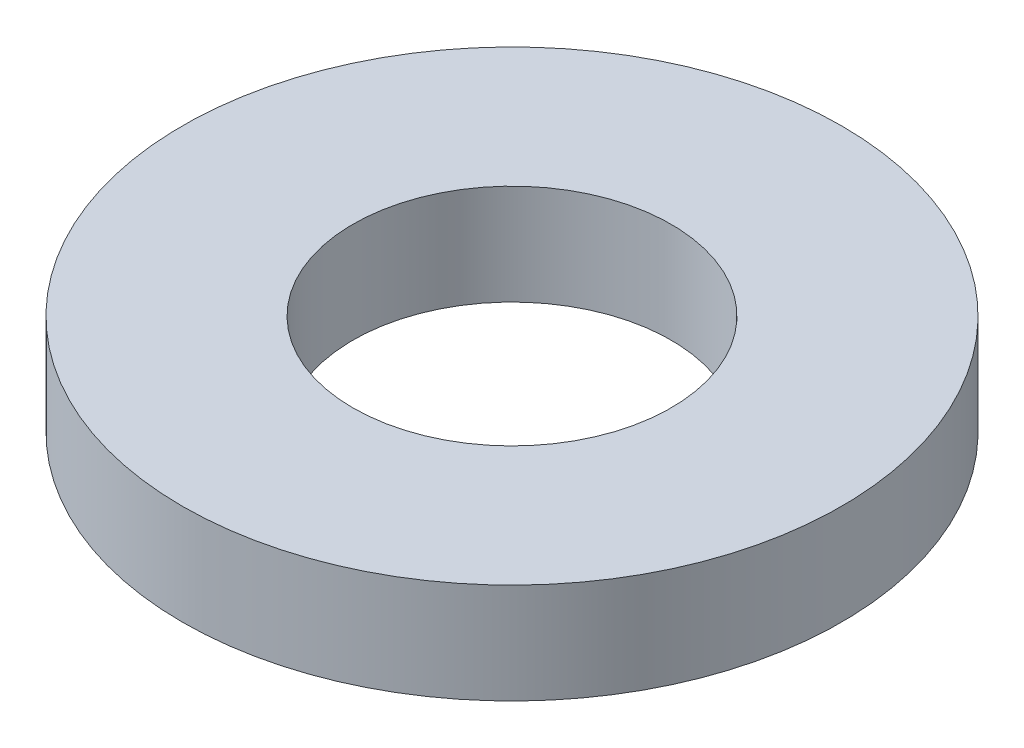
ISO-10303-21;
HEADER;
FILE_DESCRIPTION(('STEP AP214'),'2;1');
FILE_NAME('part.step','',(''),(''),'','','');
FILE_SCHEMA(('AUTOMOTIVE_DESIGN { 1 0 10303 214 1 1 1 1 }'));
ENDSEC;
DATA;
#1=APPLICATION_CONTEXT('core data for automotive mechanical design processes');
#2=APPLICATION_PROTOCOL_DEFINITION('international standard','automotive_design',2000,#1);
#3=PRODUCT_CONTEXT('',#1,'mechanical');
#4=PRODUCT('Part','Part','',(#3));
#5=PRODUCT_RELATED_PRODUCT_CATEGORY('part','',(#4));
#6=PRODUCT_DEFINITION_FORMATION('','',#4);
#7=PRODUCT_DEFINITION_CONTEXT('part definition',#1,'design');
#8=PRODUCT_DEFINITION('design','',#6,#7);
#9=PRODUCT_DEFINITION_SHAPE('','',#8);
#10=(LENGTH_UNIT() NAMED_UNIT(*) SI_UNIT(.MILLI.,.METRE.));
#11=(NAMED_UNIT(*) PLANE_ANGLE_UNIT() SI_UNIT($,.RADIAN.));
#12=(NAMED_UNIT(*) SI_UNIT($,.STERADIAN.) SOLID_ANGLE_UNIT());
#13=UNCERTAINTY_MEASURE_WITH_UNIT(LENGTH_MEASURE(1.E-05),#10,'distance_accuracy_value','');
#14=(GEOMETRIC_REPRESENTATION_CONTEXT(3) GLOBAL_UNCERTAINTY_ASSIGNED_CONTEXT((#13)) GLOBAL_UNIT_ASSIGNED_CONTEXT((#10,
#11,#12)) REPRESENTATION_CONTEXT('',''));
#15=CARTESIAN_POINT('',(0.,0.,0.));
#16=DIRECTION('',(0.,0.,1.));
#17=DIRECTION('',(1.,0.,0.));
#18=AXIS2_PLACEMENT_3D('',#15,#16,#17);
#19=CARTESIAN_POINT('',(41.0577939001171,-18.9871426298124,10.4000283791901));
#20=DIRECTION('',(0.,1.,0.));
#21=DIRECTION('',(0.,0.,1.));
#22=AXIS2_PLACEMENT_3D('',#19,#20,#21);
#23=PLANE('',#22);
#24=CARTESIAN_POINT('',(36.857793900117,-18.9871426298124,10.4000283791901));
#25=DIRECTION('',(0.,1.,0.));
#26=DIRECTION('',(0.,0.,1.));
#27=AXIS2_PLACEMENT_3D('',#24,#25,#26);
#28=CIRCLE('',#27,8.7);
#29=CARTESIAN_POINT('',(36.857793900117,-18.9871426298124,19.1000283791901));
#30=VERTEX_POINT('',#29);
#31=EDGE_CURVE('E10',#30,#30,#28,.T.);
#32=ORIENTED_EDGE('',*,*,#31,.T.);
#33=EDGE_LOOP('',(#32));
#34=FACE_BOUND('',#33,.T.);
#35=CARTESIAN_POINT('',(36.857793900117,-18.9871426298124,10.4000283791901));
#36=DIRECTION('',(0.,1.,0.));
#37=DIRECTION('',(0.,0.,1.));
#38=AXIS2_PLACEMENT_3D('',#35,#36,#37);
#39=CIRCLE('',#38,4.20000000000001);
#40=CARTESIAN_POINT('',(36.857793900117,-18.9871426298124,14.6000283791901));
#41=VERTEX_POINT('',#40);
#42=EDGE_CURVE('E40',#41,#41,#39,.T.);
#43=ORIENTED_EDGE('',*,*,#42,.F.);
#44=EDGE_LOOP('',(#43));
#45=FACE_BOUND('',#44,.T.);
#46=ADVANCED_FACE('F26',(#34,#45),#23,.T.);
#47=CARTESIAN_POINT('',(36.857793900117,-21.6371426298124,10.4000283791901));
#48=DIRECTION('',(0.,1.,0.));
#49=DIRECTION('',(0.,0.,1.));
#50=AXIS2_PLACEMENT_3D('',#47,#48,#49);
#51=CYLINDRICAL_SURFACE('',#50,8.7);
#52=CARTESIAN_POINT('',(36.857793900117,-21.6371426298124,10.4000283791901));
#53=DIRECTION('',(0.,1.,0.));
#54=DIRECTION('',(0.,0.,1.));
#55=AXIS2_PLACEMENT_3D('',#52,#53,#54);
#56=CIRCLE('',#55,8.7);
#57=CARTESIAN_POINT('',(36.857793900117,-21.6371426298124,19.1000283791901));
#58=VERTEX_POINT('',#57);
#59=EDGE_CURVE('E32',#58,#58,#56,.T.);
#60=ORIENTED_EDGE('',*,*,#59,.T.);
#61=EDGE_LOOP('',(#60));
#62=FACE_BOUND('',#61,.T.);
#63=ORIENTED_EDGE('',*,*,#31,.F.);
#64=EDGE_LOOP('',(#63));
#65=FACE_BOUND('',#64,.T.);
#66=ADVANCED_FACE('F50',(#62,#65),#51,.T.);
#67=CARTESIAN_POINT('',(45.557793900117,-21.6371426298124,10.4000283791901));
#68=DIRECTION('',(0.,-1.,0.));
#69=DIRECTION('',(0.,0.,-1.));
#70=AXIS2_PLACEMENT_3D('',#67,#68,#69);
#71=PLANE('',#70);
#72=CARTESIAN_POINT('',(36.857793900117,-21.6371426298124,10.4000283791901));
#73=DIRECTION('',(0.,1.,0.));
#74=DIRECTION('',(0.,0.,1.));
#75=AXIS2_PLACEMENT_3D('',#72,#73,#74);
#76=CIRCLE('',#75,4.20000000000001);
#77=CARTESIAN_POINT('',(36.857793900117,-21.6371426298124,14.6000283791901));
#78=VERTEX_POINT('',#77);
#79=EDGE_CURVE('E36',#78,#78,#76,.T.);
#80=ORIENTED_EDGE('',*,*,#79,.T.);
#81=EDGE_LOOP('',(#80));
#82=FACE_BOUND('',#81,.T.);
#83=ORIENTED_EDGE('',*,*,#59,.F.);
#84=EDGE_LOOP('',(#83));
#85=FACE_BOUND('',#84,.T.);
#86=ADVANCED_FACE('F54',(#82,#85),#71,.T.);
#87=CARTESIAN_POINT('',(36.857793900117,-21.6371426298124,10.4000283791901));
#88=DIRECTION('',(0.,1.,0.));
#89=DIRECTION('',(0.,0.,1.));
#90=AXIS2_PLACEMENT_3D('',#87,#88,#89);
#91=CYLINDRICAL_SURFACE('',#90,4.20000000000001);
#92=ORIENTED_EDGE('',*,*,#42,.T.);
#93=EDGE_LOOP('',(#92));
#94=FACE_BOUND('',#93,.T.);
#95=ORIENTED_EDGE('',*,*,#79,.F.);
#96=EDGE_LOOP('',(#95));
#97=FACE_BOUND('',#96,.T.);
#98=ADVANCED_FACE('F46',(#94,#97),#91,.F.);
#99=CLOSED_SHELL('',(#46,#66,#86,#98));
#100=MANIFOLD_SOLID_BREP('B2',#99);
#101=ADVANCED_BREP_SHAPE_REPRESENTATION('',(#18,#100),#14);
#102=SHAPE_DEFINITION_REPRESENTATION(#9,#101);
ENDSEC;
END-ISO-10303-21;
